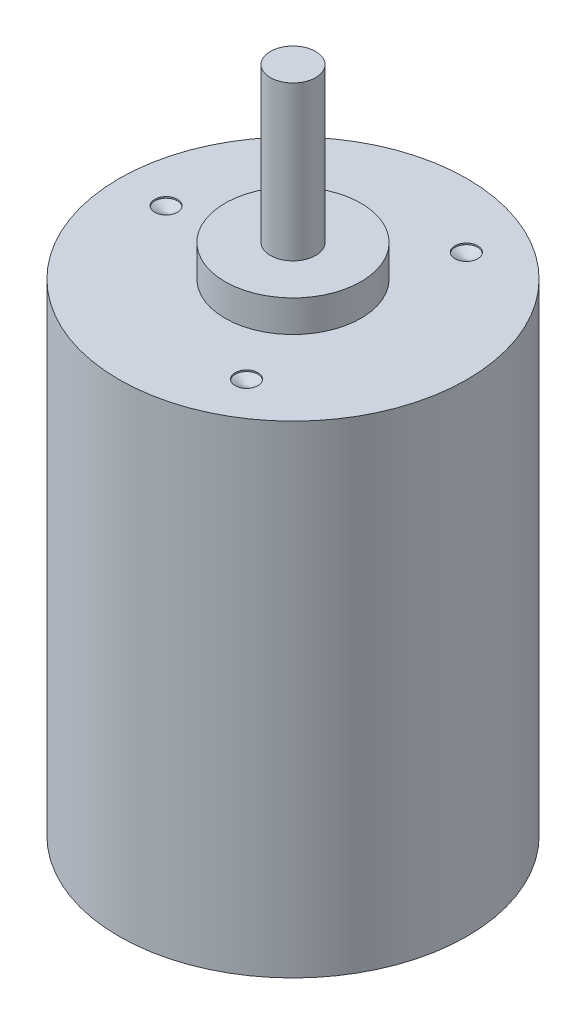
ISO-10303-21;
HEADER;
FILE_DESCRIPTION(('STEP AP214'),'2;1');
FILE_NAME('part.step','',(''),(''),'','','');
FILE_SCHEMA(('AUTOMOTIVE_DESIGN { 1 0 10303 214 1 1 1 1 }'));
ENDSEC;
DATA;
#1=APPLICATION_CONTEXT('core data for automotive mechanical design processes');
#2=APPLICATION_PROTOCOL_DEFINITION('international standard','automotive_design',2000,#1);
#3=PRODUCT_CONTEXT('',#1,'mechanical');
#4=PRODUCT('Part','Part','',(#3));
#5=PRODUCT_RELATED_PRODUCT_CATEGORY('part','',(#4));
#6=PRODUCT_DEFINITION_FORMATION('','',#4);
#7=PRODUCT_DEFINITION_CONTEXT('part definition',#1,'design');
#8=PRODUCT_DEFINITION('design','',#6,#7);
#9=PRODUCT_DEFINITION_SHAPE('','',#8);
#10=(LENGTH_UNIT() NAMED_UNIT(*) SI_UNIT(.MILLI.,.METRE.));
#11=(NAMED_UNIT(*) PLANE_ANGLE_UNIT() SI_UNIT($,.RADIAN.));
#12=(NAMED_UNIT(*) SI_UNIT($,.STERADIAN.) SOLID_ANGLE_UNIT());
#13=UNCERTAINTY_MEASURE_WITH_UNIT(LENGTH_MEASURE(1.E-05),#10,'distance_accuracy_value','');
#14=(GEOMETRIC_REPRESENTATION_CONTEXT(3) GLOBAL_UNCERTAINTY_ASSIGNED_CONTEXT((#13)) GLOBAL_UNIT_ASSIGNED_CONTEXT((#10,
#11,#12)) REPRESENTATION_CONTEXT('',''));
#15=CARTESIAN_POINT('',(0.,0.,0.));
#16=DIRECTION('',(0.,0.,1.));
#17=DIRECTION('',(1.,0.,0.));
#18=AXIS2_PLACEMENT_3D('',#15,#16,#17);
#19=CARTESIAN_POINT('',(0.,0.,0.));
#20=DIRECTION('',(0.,1.,0.));
#21=DIRECTION('',(0.,0.,1.));
#22=AXIS2_PLACEMENT_3D('',#19,#20,#21);
#23=PLANE('',#22);
#24=CARTESIAN_POINT('',(0.,0.,0.));
#25=DIRECTION('',(0.,1.,0.));
#26=DIRECTION('',(0.,0.,1.));
#27=AXIS2_PLACEMENT_3D('',#24,#25,#26);
#28=CIRCLE('',#27,19.2);
#29=CARTESIAN_POINT('',(0.,0.,19.2));
#30=VERTEX_POINT('',#29);
#31=EDGE_CURVE('E11',#30,#30,#28,.T.);
#32=ORIENTED_EDGE('',*,*,#31,.F.);
#33=EDGE_LOOP('',(#32));
#34=FACE_BOUND('',#33,.T.);
#35=ADVANCED_FACE('F40',(#34),#23,.F.);
#36=CARTESIAN_POINT('',(0.,33.9705882352941,0.));
#37=DIRECTION('',(0.,1.,0.));
#38=DIRECTION('',(0.,0.,1.));
#39=AXIS2_PLACEMENT_3D('',#36,#37,#38);
#40=CYLINDRICAL_SURFACE('',#39,19.2);
#41=CARTESIAN_POINT('',(0.,53.2,0.));
#42=DIRECTION('',(0.,1.,0.));
#43=DIRECTION('',(0.,0.,1.));
#44=AXIS2_PLACEMENT_3D('',#41,#42,#43);
#45=CIRCLE('',#44,19.2);
#46=CARTESIAN_POINT('',(0.,53.2,19.2));
#47=VERTEX_POINT('',#46);
#48=EDGE_CURVE('E47',#47,#47,#45,.T.);
#49=ORIENTED_EDGE('',*,*,#48,.F.);
#50=EDGE_LOOP('',(#49));
#51=FACE_BOUND('',#50,.T.);
#52=ORIENTED_EDGE('',*,*,#31,.T.);
#53=EDGE_LOOP('',(#52));
#54=FACE_BOUND('',#53,.T.);
#55=ADVANCED_FACE('F100',(#51,#54),#40,.T.);
#56=CARTESIAN_POINT('',(0.,53.2,-19.2));
#57=DIRECTION('',(0.,-1.,0.));
#58=DIRECTION('',(0.,0.,-1.));
#59=AXIS2_PLACEMENT_3D('',#56,#57,#58);
#60=PLANE('',#59);
#61=CARTESIAN_POINT('',(6.99999999999997,53.2,-12.1243556529822));
#62=DIRECTION('',(0.,1.,0.));
#63=DIRECTION('',(0.,0.,1.));
#64=AXIS2_PLACEMENT_3D('',#61,#62,#63);
#65=CIRCLE('',#64,1.24999999999999);
#66=CARTESIAN_POINT('',(6.99999999999997,53.2,-10.8743556529822));
#67=VERTEX_POINT('',#66);
#68=EDGE_CURVE('E68',#67,#67,#65,.T.);
#69=ORIENTED_EDGE('',*,*,#68,.F.);
#70=EDGE_LOOP('',(#69));
#71=FACE_BOUND('',#70,.T.);
#72=CARTESIAN_POINT('',(7.00000000000107,53.2,12.1243556529821));
#73=DIRECTION('',(0.,1.,0.));
#74=DIRECTION('',(0.,0.,1.));
#75=AXIS2_PLACEMENT_3D('',#72,#73,#74);
#76=CIRCLE('',#75,1.24999999999999);
#77=CARTESIAN_POINT('',(7.00000000000107,53.2,13.3743556529821));
#78=VERTEX_POINT('',#77);
#79=EDGE_CURVE('E67',#78,#78,#76,.T.);
#80=ORIENTED_EDGE('',*,*,#79,.F.);
#81=EDGE_LOOP('',(#80));
#82=FACE_BOUND('',#81,.T.);
#83=CARTESIAN_POINT('',(-13.9999999999995,53.2,9.39325935907876E-13));
#84=DIRECTION('',(0.,1.,0.));
#85=DIRECTION('',(0.,0.,1.));
#86=AXIS2_PLACEMENT_3D('',#83,#84,#85);
#87=CIRCLE('',#86,1.24999999999999);
#88=CARTESIAN_POINT('',(-13.9999999999995,53.2,1.25000000000093));
#89=VERTEX_POINT('',#88);
#90=EDGE_CURVE('E78',#89,#89,#87,.T.);
#91=ORIENTED_EDGE('',*,*,#90,.F.);
#92=EDGE_LOOP('',(#91));
#93=FACE_BOUND('',#92,.T.);
#94=CARTESIAN_POINT('',(0.,53.2,0.));
#95=DIRECTION('',(0.,1.,0.));
#96=DIRECTION('',(0.,0.,1.));
#97=AXIS2_PLACEMENT_3D('',#94,#95,#96);
#98=CIRCLE('',#97,7.5);
#99=CARTESIAN_POINT('',(0.,53.2,7.5));
#100=VERTEX_POINT('',#99);
#101=EDGE_CURVE('E93',#100,#100,#98,.T.);
#102=ORIENTED_EDGE('',*,*,#101,.F.);
#103=EDGE_LOOP('',(#102));
#104=FACE_BOUND('',#103,.T.);
#105=ORIENTED_EDGE('',*,*,#48,.T.);
#106=EDGE_LOOP('',(#105));
#107=FACE_BOUND('',#106,.T.);
#108=ADVANCED_FACE('F98',(#71,#82,#93,#104,#107),#60,.F.);
#109=CARTESIAN_POINT('',(0.,33.9705882352941,0.));
#110=DIRECTION('',(0.,1.,0.));
#111=DIRECTION('',(0.,0.,1.));
#112=AXIS2_PLACEMENT_3D('',#109,#110,#111);
#113=CYLINDRICAL_SURFACE('',#112,7.5);
#114=CARTESIAN_POINT('',(0.,56.7,0.));
#115=DIRECTION('',(0.,1.,0.));
#116=DIRECTION('',(0.,0.,1.));
#117=AXIS2_PLACEMENT_3D('',#114,#115,#116);
#118=CIRCLE('',#117,7.5);
#119=CARTESIAN_POINT('',(0.,56.7,7.5));
#120=VERTEX_POINT('',#119);
#121=EDGE_CURVE('E90',#120,#120,#118,.T.);
#122=ORIENTED_EDGE('',*,*,#121,.F.);
#123=EDGE_LOOP('',(#122));
#124=FACE_BOUND('',#123,.T.);
#125=ORIENTED_EDGE('',*,*,#101,.T.);
#126=EDGE_LOOP('',(#125));
#127=FACE_BOUND('',#126,.T.);
#128=ADVANCED_FACE('F119',(#124,#127),#113,.T.);
#129=CARTESIAN_POINT('',(0.,56.7,-7.5));
#130=DIRECTION('',(0.,-1.,0.));
#131=DIRECTION('',(0.,0.,-1.));
#132=AXIS2_PLACEMENT_3D('',#129,#130,#131);
#133=PLANE('',#132);
#134=CARTESIAN_POINT('',(0.,56.7,0.));
#135=DIRECTION('',(0.,1.,0.));
#136=DIRECTION('',(0.,0.,1.));
#137=AXIS2_PLACEMENT_3D('',#134,#135,#136);
#138=CIRCLE('',#137,2.5);
#139=CARTESIAN_POINT('',(0.,56.7,2.5));
#140=VERTEX_POINT('',#139);
#141=EDGE_CURVE('E87',#140,#140,#138,.T.);
#142=ORIENTED_EDGE('',*,*,#141,.F.);
#143=EDGE_LOOP('',(#142));
#144=FACE_BOUND('',#143,.T.);
#145=ORIENTED_EDGE('',*,*,#121,.T.);
#146=EDGE_LOOP('',(#145));
#147=FACE_BOUND('',#146,.T.);
#148=ADVANCED_FACE('F126',(#144,#147),#133,.F.);
#149=CARTESIAN_POINT('',(0.,33.9705882352941,0.));
#150=DIRECTION('',(0.,1.,0.));
#151=DIRECTION('',(0.,0.,1.));
#152=AXIS2_PLACEMENT_3D('',#149,#150,#151);
#153=CYLINDRICAL_SURFACE('',#152,2.5);
#154=CARTESIAN_POINT('',(0.,73.7,0.));
#155=DIRECTION('',(0.,1.,0.));
#156=DIRECTION('',(0.,0.,1.));
#157=AXIS2_PLACEMENT_3D('',#154,#155,#156);
#158=CIRCLE('',#157,2.5);
#159=CARTESIAN_POINT('',(0.,73.7,2.5));
#160=VERTEX_POINT('',#159);
#161=EDGE_CURVE('E84',#160,#160,#158,.T.);
#162=ORIENTED_EDGE('',*,*,#161,.F.);
#163=EDGE_LOOP('',(#162));
#164=FACE_BOUND('',#163,.T.);
#165=ORIENTED_EDGE('',*,*,#141,.T.);
#166=EDGE_LOOP('',(#165));
#167=FACE_BOUND('',#166,.T.);
#168=ADVANCED_FACE('F134',(#164,#167),#153,.T.);
#169=CARTESIAN_POINT('',(0.,73.7,-2.5));
#170=DIRECTION('',(0.,-1.,0.));
#171=DIRECTION('',(0.,0.,-1.));
#172=AXIS2_PLACEMENT_3D('',#169,#170,#171);
#173=PLANE('',#172);
#174=ORIENTED_EDGE('',*,*,#161,.T.);
#175=EDGE_LOOP('',(#174));
#176=FACE_BOUND('',#175,.T.);
#177=ADVANCED_FACE('F142',(#176),#173,.F.);
#178=CARTESIAN_POINT('',(-13.9999999999995,53.04,9.39325935907876E-13));
#179=DIRECTION('',(0.,1.,0.));
#180=DIRECTION('',(0.,0.,1.));
#181=AXIS2_PLACEMENT_3D('',#178,#179,#180);
#182=CONICAL_SURFACE('',#181,1.25,1.02974425867665);
#183=CARTESIAN_POINT('',(-13.9999999999995,52.2889242262155,9.39325935907876E-13));
#184=VERTEX_POINT('',#183);
#185=VERTEX_LOOP('',#184);
#186=FACE_BOUND('',#185,.T.);
#187=CARTESIAN_POINT('',(-13.9999999999995,53.04,9.39325935907876E-13));
#188=DIRECTION('',(0.,1.,0.));
#189=DIRECTION('',(0.,0.,1.));
#190=AXIS2_PLACEMENT_3D('',#187,#188,#189);
#191=CIRCLE('',#190,1.25);
#192=CARTESIAN_POINT('',(-13.9999999999995,53.04,1.25000000000094));
#193=VERTEX_POINT('',#192);
#194=EDGE_CURVE('E81',#193,#193,#191,.T.);
#195=ORIENTED_EDGE('',*,*,#194,.T.);
#196=EDGE_LOOP('',(#195));
#197=FACE_BOUND('',#196,.T.);
#198=ADVANCED_FACE('F150',(#186,#197),#182,.F.);
#199=CARTESIAN_POINT('',(-13.9999999999995,53.2,9.39325935907876E-13));
#200=DIRECTION('',(0.,1.,0.));
#201=DIRECTION('',(0.,0.,1.));
#202=AXIS2_PLACEMENT_3D('',#199,#200,#201);
#203=CYLINDRICAL_SURFACE('',#202,1.24999999999999);
#204=ORIENTED_EDGE('',*,*,#194,.F.);
#205=EDGE_LOOP('',(#204));
#206=FACE_BOUND('',#205,.T.);
#207=ORIENTED_EDGE('',*,*,#90,.T.);
#208=EDGE_LOOP('',(#207));
#209=FACE_BOUND('',#208,.T.);
#210=ADVANCED_FACE('F159',(#206,#209),#203,.F.);
#211=CARTESIAN_POINT('',(7.00000000000107,53.04,12.1243556529821));
#212=DIRECTION('',(0.,1.,0.));
#213=DIRECTION('',(0.,0.,1.));
#214=AXIS2_PLACEMENT_3D('',#211,#212,#213);
#215=CONICAL_SURFACE('',#214,1.25,1.02974425867665);
#216=CARTESIAN_POINT('',(7.00000000000107,52.2889242262155,12.1243556529821));
#217=VERTEX_POINT('',#216);
#218=VERTEX_LOOP('',#217);
#219=FACE_BOUND('',#218,.T.);
#220=CARTESIAN_POINT('',(7.00000000000107,53.04,12.1243556529821));
#221=DIRECTION('',(0.,1.,0.));
#222=DIRECTION('',(0.,0.,1.));
#223=AXIS2_PLACEMENT_3D('',#220,#221,#222);
#224=CIRCLE('',#223,1.25);
#225=CARTESIAN_POINT('',(7.00000000000107,53.04,13.3743556529821));
#226=VERTEX_POINT('',#225);
#227=EDGE_CURVE('E71',#226,#226,#224,.T.);
#228=ORIENTED_EDGE('',*,*,#227,.T.);
#229=EDGE_LOOP('',(#228));
#230=FACE_BOUND('',#229,.T.);
#231=ADVANCED_FACE('F167',(#219,#230),#215,.F.);
#232=CARTESIAN_POINT('',(7.00000000000107,53.2,12.1243556529821));
#233=DIRECTION('',(0.,1.,0.));
#234=DIRECTION('',(0.,0.,1.));
#235=AXIS2_PLACEMENT_3D('',#232,#233,#234);
#236=CYLINDRICAL_SURFACE('',#235,1.24999999999999);
#237=ORIENTED_EDGE('',*,*,#227,.F.);
#238=EDGE_LOOP('',(#237));
#239=FACE_BOUND('',#238,.T.);
#240=ORIENTED_EDGE('',*,*,#79,.T.);
#241=EDGE_LOOP('',(#240));
#242=FACE_BOUND('',#241,.T.);
#243=ADVANCED_FACE('F61',(#239,#242),#236,.F.);
#244=CARTESIAN_POINT('',(6.99999999999997,53.04,-12.1243556529822));
#245=DIRECTION('',(0.,1.,0.));
#246=DIRECTION('',(0.,0.,1.));
#247=AXIS2_PLACEMENT_3D('',#244,#245,#246);
#248=CONICAL_SURFACE('',#247,1.25,1.02974425867665);
#249=CARTESIAN_POINT('',(6.99999999999997,52.2889242262155,-12.1243556529822));
#250=VERTEX_POINT('',#249);
#251=VERTEX_LOOP('',#250);
#252=FACE_BOUND('',#251,.T.);
#253=CARTESIAN_POINT('',(6.99999999999997,53.04,-12.1243556529822));
#254=DIRECTION('',(0.,1.,0.));
#255=DIRECTION('',(0.,0.,1.));
#256=AXIS2_PLACEMENT_3D('',#253,#254,#255);
#257=CIRCLE('',#256,1.25);
#258=CARTESIAN_POINT('',(6.99999999999997,53.04,-10.8743556529822));
#259=VERTEX_POINT('',#258);
#260=EDGE_CURVE('E65',#259,#259,#257,.T.);
#261=ORIENTED_EDGE('',*,*,#260,.T.);
#262=EDGE_LOOP('',(#261));
#263=FACE_BOUND('',#262,.T.);
#264=ADVANCED_FACE('F57',(#252,#263),#248,.F.);
#265=CARTESIAN_POINT('',(6.99999999999997,53.2,-12.1243556529822));
#266=DIRECTION('',(0.,1.,0.));
#267=DIRECTION('',(0.,0.,1.));
#268=AXIS2_PLACEMENT_3D('',#265,#266,#267);
#269=CYLINDRICAL_SURFACE('',#268,1.24999999999999);
#270=ORIENTED_EDGE('',*,*,#260,.F.);
#271=EDGE_LOOP('',(#270));
#272=FACE_BOUND('',#271,.T.);
#273=ORIENTED_EDGE('',*,*,#68,.T.);
#274=EDGE_LOOP('',(#273));
#275=FACE_BOUND('',#274,.T.);
#276=ADVANCED_FACE('F60',(#272,#275),#269,.F.);
#277=CLOSED_SHELL('',(#35,#55,#108,#128,#148,#168,#177,#198,#210,#231,#243,#264,#276));
#278=MANIFOLD_SOLID_BREP('B2',#277);
#279=ADVANCED_BREP_SHAPE_REPRESENTATION('',(#18,#278),#14);
#280=SHAPE_DEFINITION_REPRESENTATION(#9,#279);
ENDSEC;
END-ISO-10303-21;
